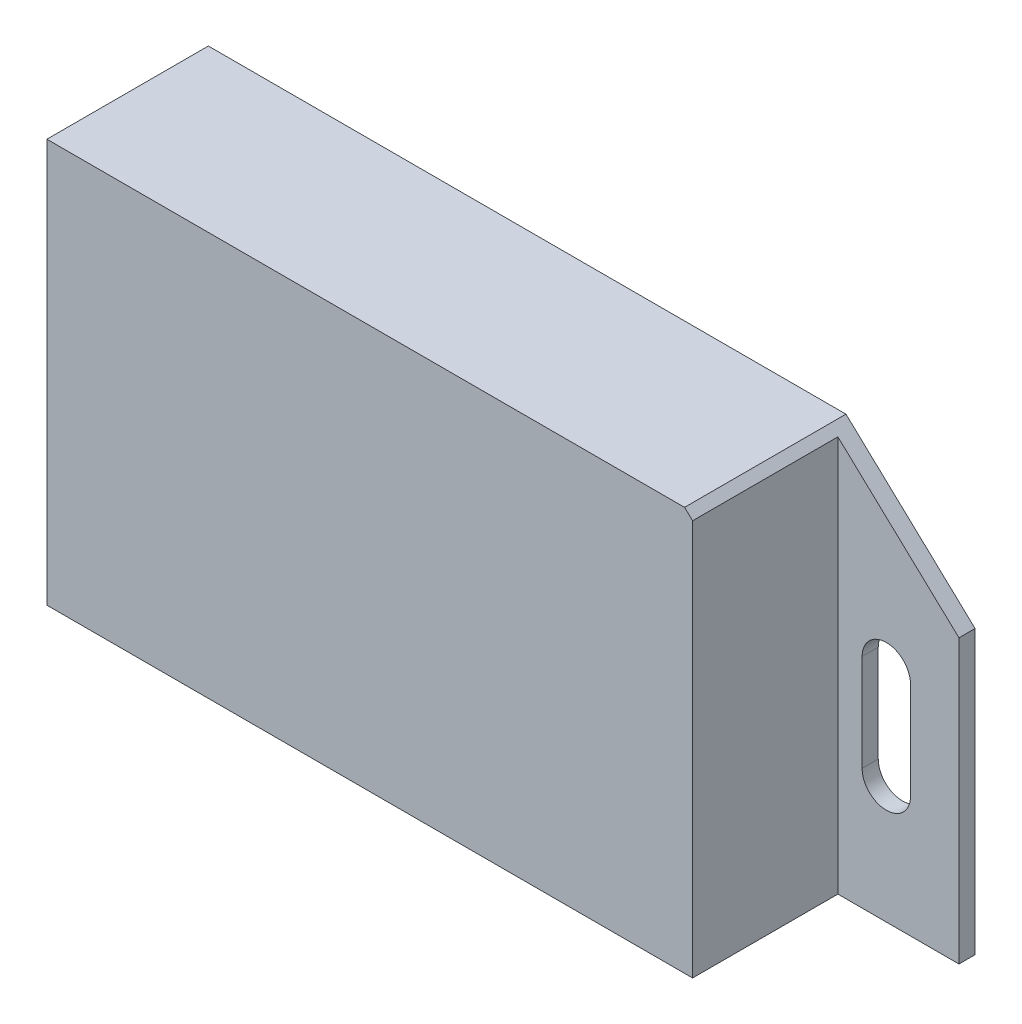
ISO-10303-21;
HEADER;
FILE_DESCRIPTION(('STEP AP214'),'2;1');
FILE_NAME('part.step','',(''),(''),'','','');
FILE_SCHEMA(('AUTOMOTIVE_DESIGN { 1 0 10303 214 1 1 1 1 }'));
ENDSEC;
DATA;
#1=APPLICATION_CONTEXT('core data for automotive mechanical design processes');
#2=APPLICATION_PROTOCOL_DEFINITION('international standard','automotive_design',2000,#1);
#3=PRODUCT_CONTEXT('',#1,'mechanical');
#4=PRODUCT('Part','Part','',(#3));
#5=PRODUCT_RELATED_PRODUCT_CATEGORY('part','',(#4));
#6=PRODUCT_DEFINITION_FORMATION('','',#4);
#7=PRODUCT_DEFINITION_CONTEXT('part definition',#1,'design');
#8=PRODUCT_DEFINITION('design','',#6,#7);
#9=PRODUCT_DEFINITION_SHAPE('','',#8);
#10=(LENGTH_UNIT() NAMED_UNIT(*) SI_UNIT(.MILLI.,.METRE.));
#11=(NAMED_UNIT(*) PLANE_ANGLE_UNIT() SI_UNIT($,.RADIAN.));
#12=(NAMED_UNIT(*) SI_UNIT($,.STERADIAN.) SOLID_ANGLE_UNIT());
#13=UNCERTAINTY_MEASURE_WITH_UNIT(LENGTH_MEASURE(1.E-05),#10,'distance_accuracy_value','');
#14=(GEOMETRIC_REPRESENTATION_CONTEXT(3) GLOBAL_UNCERTAINTY_ASSIGNED_CONTEXT((#13)) GLOBAL_UNIT_ASSIGNED_CONTEXT((#10,
#11,#12)) REPRESENTATION_CONTEXT('',''));
#15=CARTESIAN_POINT('',(0.,0.,0.));
#16=DIRECTION('',(0.,0.,1.));
#17=DIRECTION('',(1.,0.,0.));
#18=AXIS2_PLACEMENT_3D('',#15,#16,#17);
#19=CARTESIAN_POINT('',(-27.5,12.5,-10.));
#20=DIRECTION('',(-1.,0.,0.));
#21=DIRECTION('',(0.,0.,1.));
#22=AXIS2_PLACEMENT_3D('',#19,#20,#21);
#23=PLANE('',#22);
#24=DIRECTION('',(0.,-1.,0.));
#25=VECTOR('',#24,1.);
#26=CARTESIAN_POINT('',(-27.5,12.5,-9.));
#27=LINE('',#26,#25);
#28=CARTESIAN_POINT('',(-27.5,4.49999999999973,-9.));
#29=VERTEX_POINT('',#28);
#30=CARTESIAN_POINT('',(-27.5,-12.5,-9.));
#31=VERTEX_POINT('',#30);
#32=EDGE_CURVE('E377',#29,#31,#27,.T.);
#33=ORIENTED_EDGE('',*,*,#32,.F.);
#34=DIRECTION('',(0.,0.,-1.));
#35=VECTOR('',#34,1.);
#36=CARTESIAN_POINT('',(-27.5,4.49999999999973,-10.));
#37=LINE('',#36,#35);
#38=CARTESIAN_POINT('',(-27.5,4.49999999999973,-10.));
#39=VERTEX_POINT('',#38);
#40=EDGE_CURVE('E11',#29,#39,#37,.T.);
#41=ORIENTED_EDGE('',*,*,#40,.T.);
#42=DIRECTION('',(0.,-1.,0.));
#43=VECTOR('',#42,1.);
#44=CARTESIAN_POINT('',(-27.5,12.5,-10.));
#45=LINE('',#44,#43);
#46=CARTESIAN_POINT('',(-27.5,-12.5,-10.));
#47=VERTEX_POINT('',#46);
#48=EDGE_CURVE('E419',#39,#47,#45,.T.);
#49=ORIENTED_EDGE('',*,*,#48,.T.);
#50=DIRECTION('',(0.,0.,1.));
#51=VECTOR('',#50,1.);
#52=CARTESIAN_POINT('',(-27.5,-12.5,-10.));
#53=LINE('',#52,#51);
#54=EDGE_CURVE('E431',#47,#31,#53,.T.);
#55=ORIENTED_EDGE('',*,*,#54,.T.);
#56=EDGE_LOOP('',(#33,#41,#49,#55));
#57=FACE_BOUND('',#56,.T.);
#58=ADVANCED_FACE('F41',(#57),#23,.T.);
#59=CARTESIAN_POINT('',(27.5,12.5,-10.));
#60=DIRECTION('',(0.,1.,0.));
#61=DIRECTION('',(0.,0.,1.));
#62=AXIS2_PLACEMENT_3D('',#59,#60,#61);
#63=PLANE('',#62);
#64=DIRECTION('',(-1.,0.,0.));
#65=VECTOR('',#64,1.);
#66=CARTESIAN_POINT('',(27.5,12.5,0.));
#67=LINE('',#66,#65);
#68=CARTESIAN_POINT('',(19.4999999999997,12.5,0.));
#69=VERTEX_POINT('',#68);
#70=CARTESIAN_POINT('',(-20.,12.5,0.));
#71=VERTEX_POINT('',#70);
#72=EDGE_CURVE('E422',#69,#71,#67,.T.);
#73=ORIENTED_EDGE('',*,*,#72,.F.);
#74=DIRECTION('',(0.,0.,-1.));
#75=VECTOR('',#74,1.);
#76=CARTESIAN_POINT('',(19.4999999999997,12.5,-10.));
#77=LINE('',#76,#75);
#78=CARTESIAN_POINT('',(19.4999999999997,12.5,-10.));
#79=VERTEX_POINT('',#78);
#80=EDGE_CURVE('E476',#69,#79,#77,.T.);
#81=ORIENTED_EDGE('',*,*,#80,.T.);
#82=DIRECTION('',(-1.,0.,0.));
#83=VECTOR('',#82,1.);
#84=CARTESIAN_POINT('',(27.5,12.5,-10.));
#85=LINE('',#84,#83);
#86=CARTESIAN_POINT('',(-20.0000000000003,12.5,-10.));
#87=VERTEX_POINT('',#86);
#88=EDGE_CURVE('E428',#79,#87,#85,.T.);
#89=ORIENTED_EDGE('',*,*,#88,.T.);
#90=DIRECTION('',(0.,0.,1.));
#91=VECTOR('',#90,1.);
#92=CARTESIAN_POINT('',(-20.0000000000003,12.5,-10.));
#93=LINE('',#92,#91);
#94=CARTESIAN_POINT('',(-20.,12.5,-9.));
#95=VERTEX_POINT('',#94);
#96=EDGE_CURVE('E473',#87,#95,#93,.T.);
#97=ORIENTED_EDGE('',*,*,#96,.T.);
#98=DIRECTION('',(0.,0.,1.));
#99=VECTOR('',#98,1.);
#100=CARTESIAN_POINT('',(-20.,12.5,-9.));
#101=LINE('',#100,#99);
#102=EDGE_CURVE('E369',#95,#71,#101,.T.);
#103=ORIENTED_EDGE('',*,*,#102,.T.);
#104=EDGE_LOOP('',(#73,#81,#89,#97,#103));
#105=FACE_BOUND('',#104,.T.);
#106=ADVANCED_FACE('F514',(#105),#63,.T.);
#107=CARTESIAN_POINT('',(27.5,-12.5,-10.));
#108=DIRECTION('',(1.,0.,0.));
#109=DIRECTION('',(0.,0.,-1.));
#110=AXIS2_PLACEMENT_3D('',#107,#108,#109);
#111=PLANE('',#110);
#112=DIRECTION('',(0.,1.,0.));
#113=VECTOR('',#112,1.);
#114=CARTESIAN_POINT('',(27.5,-12.5,-10.));
#115=LINE('',#114,#113);
#116=CARTESIAN_POINT('',(27.5,-12.5,-10.));
#117=VERTEX_POINT('',#116);
#118=CARTESIAN_POINT('',(27.5,5.00000000000027,-10.));
#119=VERTEX_POINT('',#118);
#120=EDGE_CURVE('E425',#117,#119,#115,.T.);
#121=ORIENTED_EDGE('',*,*,#120,.T.);
#122=DIRECTION('',(0.,0.,1.));
#123=VECTOR('',#122,1.);
#124=CARTESIAN_POINT('',(27.5,5.00000000000027,-10.));
#125=LINE('',#124,#123);
#126=CARTESIAN_POINT('',(27.5,5.00000000000027,-9.));
#127=VERTEX_POINT('',#126);
#128=EDGE_CURVE('E464',#119,#127,#125,.T.);
#129=ORIENTED_EDGE('',*,*,#128,.T.);
#130=DIRECTION('',(0.,-1.,0.));
#131=VECTOR('',#130,1.);
#132=CARTESIAN_POINT('',(27.5,12.5,-9.));
#133=LINE('',#132,#131);
#134=CARTESIAN_POINT('',(27.5,-12.5,-9.));
#135=VERTEX_POINT('',#134);
#136=EDGE_CURVE('E363',#127,#135,#133,.T.);
#137=ORIENTED_EDGE('',*,*,#136,.T.);
#138=DIRECTION('',(0.,0.,1.));
#139=VECTOR('',#138,1.);
#140=CARTESIAN_POINT('',(27.5,-12.5,-10.));
#141=LINE('',#140,#139);
#142=EDGE_CURVE('E435',#117,#135,#141,.T.);
#143=ORIENTED_EDGE('',*,*,#142,.F.);
#144=EDGE_LOOP('',(#121,#129,#137,#143));
#145=FACE_BOUND('',#144,.T.);
#146=ADVANCED_FACE('F491',(#145),#111,.T.);
#147=CARTESIAN_POINT('',(-27.5,-12.5,-10.));
#148=DIRECTION('',(0.,-1.,0.));
#149=DIRECTION('',(0.,0.,-1.));
#150=AXIS2_PLACEMENT_3D('',#147,#148,#149);
#151=PLANE('',#150);
#152=DIRECTION('',(-1.,0.,0.));
#153=VECTOR('',#152,1.);
#154=CARTESIAN_POINT('',(10.,-12.5,-7.5));
#155=LINE('',#154,#153);
#156=CARTESIAN_POINT('',(10.,-12.5,-7.5));
#157=VERTEX_POINT('',#156);
#158=CARTESIAN_POINT('',(-10.,-12.5,-7.5));
#159=VERTEX_POINT('',#158);
#160=EDGE_CURVE('E246',#157,#159,#155,.T.);
#161=ORIENTED_EDGE('',*,*,#160,.F.);
#162=DIRECTION('',(0.,0.,1.));
#163=VECTOR('',#162,1.);
#164=CARTESIAN_POINT('',(10.,-12.5,-9.));
#165=LINE('',#164,#163);
#166=CARTESIAN_POINT('',(10.,-12.5,-9.));
#167=VERTEX_POINT('',#166);
#168=EDGE_CURVE('E263',#167,#157,#165,.T.);
#169=ORIENTED_EDGE('',*,*,#168,.F.);
#170=DIRECTION('',(1.,0.,0.));
#171=VECTOR('',#170,1.);
#172=CARTESIAN_POINT('',(-10.,-12.5,-9.));
#173=LINE('',#172,#171);
#174=CARTESIAN_POINT('',(-10.,-12.5,-9.));
#175=VERTEX_POINT('',#174);
#176=EDGE_CURVE('E266',#175,#167,#173,.T.);
#177=ORIENTED_EDGE('',*,*,#176,.F.);
#178=DIRECTION('',(0.,0.,-1.));
#179=VECTOR('',#178,1.);
#180=CARTESIAN_POINT('',(-10.,-12.5,-7.5));
#181=LINE('',#180,#179);
#182=EDGE_CURVE('E272',#159,#175,#181,.T.);
#183=ORIENTED_EDGE('',*,*,#182,.F.);
#184=EDGE_LOOP('',(#161,#169,#177,#183));
#185=FACE_BOUND('',#184,.T.);
#186=DIRECTION('',(1.,0.,0.));
#187=VECTOR('',#186,1.);
#188=CARTESIAN_POINT('',(-10.99589645914,-12.5,-2.8));
#189=LINE('',#188,#187);
#190=CARTESIAN_POINT('',(-10.99589645914,-12.5,-2.8));
#191=VERTEX_POINT('',#190);
#192=CARTESIAN_POINT('',(-10.2,-12.5,-2.8));
#193=VERTEX_POINT('',#192);
#194=EDGE_CURVE('E296',#191,#193,#189,.T.);
#195=ORIENTED_EDGE('',*,*,#194,.F.);
#196=DIRECTION('',(0.,0.,-1.));
#197=VECTOR('',#196,1.);
#198=CARTESIAN_POINT('',(-10.99589645914,-12.5,-2.));
#199=LINE('',#198,#197);
#200=CARTESIAN_POINT('',(-10.99589645914,-12.5,-2.));
#201=VERTEX_POINT('',#200);
#202=EDGE_CURVE('E308',#201,#191,#199,.T.);
#203=ORIENTED_EDGE('',*,*,#202,.F.);
#204=DIRECTION('',(1.,0.,0.));
#205=VECTOR('',#204,1.);
#206=CARTESIAN_POINT('',(-10.99589645914,-12.5,-2.));
#207=LINE('',#206,#205);
#208=CARTESIAN_POINT('',(-10.2,-12.5,-2.));
#209=VERTEX_POINT('',#208);
#210=EDGE_CURVE('E282',#201,#209,#207,.T.);
#211=ORIENTED_EDGE('',*,*,#210,.T.);
#212=DIRECTION('',(0.,0.,-1.));
#213=VECTOR('',#212,1.);
#214=CARTESIAN_POINT('',(-10.2,-12.5,-1.8));
#215=LINE('',#214,#213);
#216=CARTESIAN_POINT('',(-10.2,-12.5,-1.8));
#217=VERTEX_POINT('',#216);
#218=EDGE_CURVE('E403',#217,#209,#215,.T.);
#219=ORIENTED_EDGE('',*,*,#218,.F.);
#220=DIRECTION('',(-1.,0.,0.));
#221=VECTOR('',#220,1.);
#222=CARTESIAN_POINT('',(10.2,-12.5,-1.8));
#223=LINE('',#222,#221);
#224=CARTESIAN_POINT('',(10.2,-12.5,-1.8));
#225=VERTEX_POINT('',#224);
#226=EDGE_CURVE('E399',#225,#217,#223,.T.);
#227=ORIENTED_EDGE('',*,*,#226,.F.);
#228=DIRECTION('',(0.,0.,1.));
#229=VECTOR('',#228,1.);
#230=CARTESIAN_POINT('',(10.2,-12.5,-3.2));
#231=LINE('',#230,#229);
#232=CARTESIAN_POINT('',(10.2,-12.5,-3.2));
#233=VERTEX_POINT('',#232);
#234=EDGE_CURVE('E379',#233,#225,#231,.T.);
#235=ORIENTED_EDGE('',*,*,#234,.F.);
#236=DIRECTION('',(1.,0.,0.));
#237=VECTOR('',#236,1.);
#238=CARTESIAN_POINT('',(-10.2,-12.5,-3.2));
#239=LINE('',#238,#237);
#240=CARTESIAN_POINT('',(-10.2,-12.5,-3.2));
#241=VERTEX_POINT('',#240);
#242=EDGE_CURVE('E388',#241,#233,#239,.T.);
#243=ORIENTED_EDGE('',*,*,#242,.F.);
#244=EDGE_CURVE('E402',#193,#241,#215,.T.);
#245=ORIENTED_EDGE('',*,*,#244,.F.);
#246=EDGE_LOOP('',(#195,#203,#211,#219,#227,#235,#243,#245));
#247=FACE_BOUND('',#246,.T.);
#248=DIRECTION('',(1.,0.,0.));
#249=VECTOR('',#248,1.);
#250=CARTESIAN_POINT('',(20.,-12.5,-9.));
#251=LINE('',#250,#249);
#252=CARTESIAN_POINT('',(20.,-12.5,-9.));
#253=VERTEX_POINT('',#252);
#254=EDGE_CURVE('E359',#253,#135,#251,.T.);
#255=ORIENTED_EDGE('',*,*,#254,.F.);
#256=DIRECTION('',(0.,0.,-1.));
#257=VECTOR('',#256,1.);
#258=CARTESIAN_POINT('',(20.,-12.5,0.));
#259=LINE('',#258,#257);
#260=CARTESIAN_POINT('',(20.,-12.5,0.));
#261=VERTEX_POINT('',#260);
#262=EDGE_CURVE('E350',#261,#253,#259,.T.);
#263=ORIENTED_EDGE('',*,*,#262,.F.);
#264=DIRECTION('',(1.,0.,0.));
#265=VECTOR('',#264,1.);
#266=CARTESIAN_POINT('',(-27.5,-12.5,0.));
#267=LINE('',#266,#265);
#268=CARTESIAN_POINT('',(-20.,-12.5,0.));
#269=VERTEX_POINT('',#268);
#270=EDGE_CURVE('E411',#269,#261,#267,.T.);
#271=ORIENTED_EDGE('',*,*,#270,.F.);
#272=DIRECTION('',(0.,0.,1.));
#273=VECTOR('',#272,1.);
#274=CARTESIAN_POINT('',(-20.,-12.5,-9.));
#275=LINE('',#274,#273);
#276=CARTESIAN_POINT('',(-20.,-12.5,-9.));
#277=VERTEX_POINT('',#276);
#278=EDGE_CURVE('E373',#277,#269,#275,.T.);
#279=ORIENTED_EDGE('',*,*,#278,.F.);
#280=DIRECTION('',(1.,0.,0.));
#281=VECTOR('',#280,1.);
#282=CARTESIAN_POINT('',(-27.5,-12.5,-9.));
#283=LINE('',#282,#281);
#284=EDGE_CURVE('E365',#31,#277,#283,.T.);
#285=ORIENTED_EDGE('',*,*,#284,.F.);
#286=ORIENTED_EDGE('',*,*,#54,.F.);
#287=DIRECTION('',(1.,0.,0.));
#288=VECTOR('',#287,1.);
#289=CARTESIAN_POINT('',(-27.5,-12.5,-10.));
#290=LINE('',#289,#288);
#291=EDGE_CURVE('E421',#47,#117,#290,.T.);
#292=ORIENTED_EDGE('',*,*,#291,.T.);
#293=ORIENTED_EDGE('',*,*,#142,.T.);
#294=EDGE_LOOP('',(#255,#263,#271,#279,#285,#286,#292,#293));
#295=FACE_BOUND('',#294,.T.);
#296=ADVANCED_FACE('F506',(#185,#247,#295),#151,.T.);
#297=CARTESIAN_POINT('',(0.,0.,-10.));
#298=DIRECTION('',(0.,0.,1.));
#299=DIRECTION('',(1.,0.,0.));
#300=AXIS2_PLACEMENT_3D('',#297,#298,#299);
#301=PLANE('',#300);
#302=DIRECTION('',(0.,-1.,0.));
#303=VECTOR('',#302,1.);
#304=CARTESIAN_POINT('',(24.5,1.,-10.));
#305=LINE('',#304,#303);
#306=CARTESIAN_POINT('',(24.5,1.,-10.));
#307=VERTEX_POINT('',#306);
#308=CARTESIAN_POINT('',(24.5,-5.,-10.));
#309=VERTEX_POINT('',#308);
#310=EDGE_CURVE('E318',#307,#309,#305,.T.);
#311=ORIENTED_EDGE('',*,*,#310,.F.);
#312=CARTESIAN_POINT('',(23.,1.,-10.));
#313=DIRECTION('',(0.,0.,-1.));
#314=DIRECTION('',(-1.,0.,0.));
#315=AXIS2_PLACEMENT_3D('',#312,#313,#314);
#316=CIRCLE('',#315,1.5);
#317=CARTESIAN_POINT('',(21.5,1.,-10.));
#318=VERTEX_POINT('',#317);
#319=EDGE_CURVE('E310',#318,#307,#316,.T.);
#320=ORIENTED_EDGE('',*,*,#319,.F.);
#321=DIRECTION('',(0.,1.,0.));
#322=VECTOR('',#321,1.);
#323=CARTESIAN_POINT('',(21.5,-5.,-10.));
#324=LINE('',#323,#322);
#325=CARTESIAN_POINT('',(21.5,-5.,-10.));
#326=VERTEX_POINT('',#325);
#327=EDGE_CURVE('E324',#326,#318,#324,.T.);
#328=ORIENTED_EDGE('',*,*,#327,.F.);
#329=CARTESIAN_POINT('',(23.,-5.,-10.));
#330=DIRECTION('',(0.,0.,-1.));
#331=DIRECTION('',(-1.,0.,0.));
#332=AXIS2_PLACEMENT_3D('',#329,#330,#331);
#333=CIRCLE('',#332,1.5);
#334=EDGE_CURVE('E321',#309,#326,#333,.T.);
#335=ORIENTED_EDGE('',*,*,#334,.F.);
#336=EDGE_LOOP('',(#311,#320,#328,#335));
#337=FACE_BOUND('',#336,.T.);
#338=DIRECTION('',(0.,-1.,0.));
#339=VECTOR('',#338,1.);
#340=CARTESIAN_POINT('',(-21.5,1.,-10.));
#341=LINE('',#340,#339);
#342=CARTESIAN_POINT('',(-21.5,1.,-10.));
#343=VERTEX_POINT('',#342);
#344=CARTESIAN_POINT('',(-21.5,-5.,-10.));
#345=VERTEX_POINT('',#344);
#346=EDGE_CURVE('E338',#343,#345,#341,.T.);
#347=ORIENTED_EDGE('',*,*,#346,.F.);
#348=CARTESIAN_POINT('',(-23.,1.,-10.));
#349=DIRECTION('',(0.,0.,-1.));
#350=DIRECTION('',(-1.,0.,0.));
#351=AXIS2_PLACEMENT_3D('',#348,#349,#350);
#352=CIRCLE('',#351,1.5);
#353=CARTESIAN_POINT('',(-24.5,1.,-10.));
#354=VERTEX_POINT('',#353);
#355=EDGE_CURVE('E330',#354,#343,#352,.T.);
#356=ORIENTED_EDGE('',*,*,#355,.F.);
#357=DIRECTION('',(0.,1.,0.));
#358=VECTOR('',#357,1.);
#359=CARTESIAN_POINT('',(-24.5,-5.,-10.));
#360=LINE('',#359,#358);
#361=CARTESIAN_POINT('',(-24.5,-5.,-10.));
#362=VERTEX_POINT('',#361);
#363=EDGE_CURVE('E344',#362,#354,#360,.T.);
#364=ORIENTED_EDGE('',*,*,#363,.F.);
#365=CARTESIAN_POINT('',(-23.,-5.,-10.));
#366=DIRECTION('',(0.,0.,-1.));
#367=DIRECTION('',(-1.,0.,0.));
#368=AXIS2_PLACEMENT_3D('',#365,#366,#367);
#369=CIRCLE('',#368,1.5);
#370=EDGE_CURVE('E341',#345,#362,#369,.T.);
#371=ORIENTED_EDGE('',*,*,#370,.F.);
#372=EDGE_LOOP('',(#347,#356,#364,#371));
#373=FACE_BOUND('',#372,.T.);
#374=ORIENTED_EDGE('',*,*,#88,.F.);
#375=DIRECTION('',(-0.729537204140109,0.683941128881304,0.));
#376=VECTOR('',#375,1.);
#377=CARTESIAN_POINT('',(27.5,5.00000000000027,-10.));
#378=LINE('',#377,#376);
#379=EDGE_CURVE('E480',#79,#119,#378,.F.);
#380=ORIENTED_EDGE('',*,*,#379,.T.);
#381=ORIENTED_EDGE('',*,*,#120,.F.);
#382=ORIENTED_EDGE('',*,*,#291,.F.);
#383=ORIENTED_EDGE('',*,*,#48,.F.);
#384=DIRECTION('',(-0.683941128881304,-0.729537204140109,0.));
#385=VECTOR('',#384,1.);
#386=CARTESIAN_POINT('',(-20.0000000000003,12.5,-10.));
#387=LINE('',#386,#385);
#388=EDGE_CURVE('E478',#39,#87,#387,.F.);
#389=ORIENTED_EDGE('',*,*,#388,.T.);
#390=EDGE_LOOP('',(#374,#380,#381,#382,#383,#389));
#391=FACE_BOUND('',#390,.T.);
#392=ADVANCED_FACE('F485',(#337,#373,#391),#301,.F.);
#393=CARTESIAN_POINT('',(0.,0.,0.));
#394=DIRECTION('',(0.,0.,1.));
#395=DIRECTION('',(1.,0.,0.));
#396=AXIS2_PLACEMENT_3D('',#393,#394,#395);
#397=PLANE('',#396);
#398=DIRECTION('',(0.,-1.,0.));
#399=VECTOR('',#398,1.);
#400=CARTESIAN_POINT('',(20.,12.5,0.));
#401=LINE('',#400,#399);
#402=CARTESIAN_POINT('',(20.,12.0312499999998,0.));
#403=VERTEX_POINT('',#402);
#404=EDGE_CURVE('E362',#403,#261,#401,.T.);
#405=ORIENTED_EDGE('',*,*,#404,.F.);
#406=DIRECTION('',(0.729537204140109,-0.683941128881304,0.));
#407=VECTOR('',#406,1.);
#408=CARTESIAN_POINT('',(15.358627858627,16.3825363825366,0.));
#409=LINE('',#408,#407);
#410=EDGE_CURVE('E471',#403,#69,#409,.F.);
#411=ORIENTED_EDGE('',*,*,#410,.T.);
#412=ORIENTED_EDGE('',*,*,#72,.T.);
#413=DIRECTION('',(0.,-1.,0.));
#414=VECTOR('',#413,1.);
#415=CARTESIAN_POINT('',(-20.,12.5,0.));
#416=LINE('',#415,#414);
#417=EDGE_CURVE('E380',#71,#269,#416,.T.);
#418=ORIENTED_EDGE('',*,*,#417,.T.);
#419=ORIENTED_EDGE('',*,*,#270,.T.);
#420=EDGE_LOOP('',(#405,#411,#412,#418,#419));
#421=FACE_BOUND('',#420,.T.);
#422=ADVANCED_FACE('F522',(#421),#397,.T.);
#423=CARTESIAN_POINT('',(10.2,-10.5,-3.2));
#424=DIRECTION('',(1.,0.,0.));
#425=DIRECTION('',(0.,0.,-1.));
#426=AXIS2_PLACEMENT_3D('',#423,#424,#425);
#427=PLANE('',#426);
#428=ORIENTED_EDGE('',*,*,#234,.T.);
#429=DIRECTION('',(0.,-1.,0.));
#430=VECTOR('',#429,1.);
#431=CARTESIAN_POINT('',(10.2,-10.5,-1.8));
#432=LINE('',#431,#430);
#433=CARTESIAN_POINT('',(10.2,-10.5,-1.8));
#434=VERTEX_POINT('',#433);
#435=EDGE_CURVE('E397',#434,#225,#432,.T.);
#436=ORIENTED_EDGE('',*,*,#435,.F.);
#437=DIRECTION('',(0.,0.,1.));
#438=VECTOR('',#437,1.);
#439=CARTESIAN_POINT('',(10.2,-10.5,-3.2));
#440=LINE('',#439,#438);
#441=CARTESIAN_POINT('',(10.2,-10.5,-3.2));
#442=VERTEX_POINT('',#441);
#443=EDGE_CURVE('E384',#442,#434,#440,.T.);
#444=ORIENTED_EDGE('',*,*,#443,.F.);
#445=DIRECTION('',(0.,-1.,0.));
#446=VECTOR('',#445,1.);
#447=CARTESIAN_POINT('',(10.2,-10.5,-3.2));
#448=LINE('',#447,#446);
#449=EDGE_CURVE('E409',#442,#233,#448,.T.);
#450=ORIENTED_EDGE('',*,*,#449,.T.);
#451=EDGE_LOOP('',(#428,#436,#444,#450));
#452=FACE_BOUND('',#451,.T.);
#453=ADVANCED_FACE('F630',(#452),#427,.F.);
#454=CARTESIAN_POINT('',(-10.2,-10.5,-3.2));
#455=DIRECTION('',(0.,0.,-1.));
#456=DIRECTION('',(-1.,0.,0.));
#457=AXIS2_PLACEMENT_3D('',#454,#455,#456);
#458=PLANE('',#457);
#459=ORIENTED_EDGE('',*,*,#242,.T.);
#460=ORIENTED_EDGE('',*,*,#449,.F.);
#461=DIRECTION('',(1.,0.,0.));
#462=VECTOR('',#461,1.);
#463=CARTESIAN_POINT('',(-10.2,-10.5,-3.2));
#464=LINE('',#463,#462);
#465=CARTESIAN_POINT('',(-10.2,-10.5,-3.2));
#466=VERTEX_POINT('',#465);
#467=EDGE_CURVE('E394',#466,#442,#464,.T.);
#468=ORIENTED_EDGE('',*,*,#467,.F.);
#469=DIRECTION('',(0.,-1.,0.));
#470=VECTOR('',#469,1.);
#471=CARTESIAN_POINT('',(-10.2,-10.5,-3.2));
#472=LINE('',#471,#470);
#473=EDGE_CURVE('E412',#466,#241,#472,.T.);
#474=ORIENTED_EDGE('',*,*,#473,.T.);
#475=EDGE_LOOP('',(#459,#460,#468,#474));
#476=FACE_BOUND('',#475,.T.);
#477=ADVANCED_FACE('F626',(#476),#458,.F.);
#478=CARTESIAN_POINT('',(-10.2,-10.5,-1.8));
#479=DIRECTION('',(-1.,0.,0.));
#480=DIRECTION('',(0.,0.,1.));
#481=AXIS2_PLACEMENT_3D('',#478,#479,#480);
#482=PLANE('',#481);
#483=ORIENTED_EDGE('',*,*,#218,.T.);
#484=EDGE_CURVE('E406',#209,#193,#215,.T.);
#485=ORIENTED_EDGE('',*,*,#484,.T.);
#486=ORIENTED_EDGE('',*,*,#244,.T.);
#487=ORIENTED_EDGE('',*,*,#473,.F.);
#488=DIRECTION('',(0.,0.,-1.));
#489=VECTOR('',#488,1.);
#490=CARTESIAN_POINT('',(-10.2,-10.5,-1.8));
#491=LINE('',#490,#489);
#492=CARTESIAN_POINT('',(-10.2,-10.5,-1.8));
#493=VERTEX_POINT('',#492);
#494=EDGE_CURVE('E391',#493,#466,#491,.T.);
#495=ORIENTED_EDGE('',*,*,#494,.F.);
#496=DIRECTION('',(0.,-1.,0.));
#497=VECTOR('',#496,1.);
#498=CARTESIAN_POINT('',(-10.2,-10.5,-1.8));
#499=LINE('',#498,#497);
#500=EDGE_CURVE('E415',#493,#217,#499,.T.);
#501=ORIENTED_EDGE('',*,*,#500,.T.);
#502=EDGE_LOOP('',(#483,#485,#486,#487,#495,#501));
#503=FACE_BOUND('',#502,.T.);
#504=ADVANCED_FACE('F629',(#503),#482,.F.);
#505=CARTESIAN_POINT('',(10.2,-10.5,-1.8));
#506=DIRECTION('',(0.,0.,1.));
#507=DIRECTION('',(1.,0.,0.));
#508=AXIS2_PLACEMENT_3D('',#505,#506,#507);
#509=PLANE('',#508);
#510=ORIENTED_EDGE('',*,*,#226,.T.);
#511=ORIENTED_EDGE('',*,*,#500,.F.);
#512=DIRECTION('',(-1.,0.,0.));
#513=VECTOR('',#512,1.);
#514=CARTESIAN_POINT('',(10.2,-10.5,-1.8));
#515=LINE('',#514,#513);
#516=EDGE_CURVE('E387',#434,#493,#515,.T.);
#517=ORIENTED_EDGE('',*,*,#516,.F.);
#518=ORIENTED_EDGE('',*,*,#435,.T.);
#519=EDGE_LOOP('',(#510,#511,#517,#518));
#520=FACE_BOUND('',#519,.T.);
#521=ADVANCED_FACE('F624',(#520),#509,.F.);
#522=CARTESIAN_POINT('',(0.,-10.5,0.));
#523=DIRECTION('',(0.,-1.,0.));
#524=DIRECTION('',(0.,0.,-1.));
#525=AXIS2_PLACEMENT_3D('',#522,#523,#524);
#526=PLANE('',#525);
#527=ORIENTED_EDGE('',*,*,#443,.T.);
#528=ORIENTED_EDGE('',*,*,#516,.T.);
#529=ORIENTED_EDGE('',*,*,#494,.T.);
#530=ORIENTED_EDGE('',*,*,#467,.T.);
#531=EDGE_LOOP('',(#527,#528,#529,#530));
#532=FACE_BOUND('',#531,.T.);
#533=ADVANCED_FACE('F620',(#532),#526,.T.);
#534=CARTESIAN_POINT('',(-27.5,12.5,-9.));
#535=DIRECTION('',(0.,0.,-1.));
#536=DIRECTION('',(-1.,0.,0.));
#537=AXIS2_PLACEMENT_3D('',#534,#535,#536);
#538=PLANE('',#537);
#539=DIRECTION('',(0.,1.,0.));
#540=VECTOR('',#539,1.);
#541=CARTESIAN_POINT('',(-24.5,12.5,-9.));
#542=LINE('',#541,#540);
#543=CARTESIAN_POINT('',(-24.5,-5.,-9.));
#544=VERTEX_POINT('',#543);
#545=CARTESIAN_POINT('',(-24.5,1.,-9.));
#546=VERTEX_POINT('',#545);
#547=EDGE_CURVE('E446',#544,#546,#542,.T.);
#548=ORIENTED_EDGE('',*,*,#547,.T.);
#549=CARTESIAN_POINT('',(-23.,1.,-9.));
#550=DIRECTION('',(0.,0.,-1.));
#551=DIRECTION('',(-1.,0.,0.));
#552=AXIS2_PLACEMENT_3D('',#549,#550,#551);
#553=CIRCLE('',#552,1.5);
#554=CARTESIAN_POINT('',(-21.5,1.,-9.));
#555=VERTEX_POINT('',#554);
#556=EDGE_CURVE('E449',#546,#555,#553,.T.);
#557=ORIENTED_EDGE('',*,*,#556,.T.);
#558=DIRECTION('',(0.,-1.,0.));
#559=VECTOR('',#558,1.);
#560=CARTESIAN_POINT('',(-21.5,12.5,-9.));
#561=LINE('',#560,#559);
#562=CARTESIAN_POINT('',(-21.5,-5.,-9.));
#563=VERTEX_POINT('',#562);
#564=EDGE_CURVE('E438',#555,#563,#561,.T.);
#565=ORIENTED_EDGE('',*,*,#564,.T.);
#566=CARTESIAN_POINT('',(-23.,-5.,-9.));
#567=DIRECTION('',(0.,0.,-1.));
#568=DIRECTION('',(-1.,0.,0.));
#569=AXIS2_PLACEMENT_3D('',#566,#567,#568);
#570=CIRCLE('',#569,1.5);
#571=EDGE_CURVE('E443',#563,#544,#570,.T.);
#572=ORIENTED_EDGE('',*,*,#571,.T.);
#573=EDGE_LOOP('',(#548,#557,#565,#572));
#574=FACE_BOUND('',#573,.T.);
#575=DIRECTION('',(0.,-1.,0.));
#576=VECTOR('',#575,1.);
#577=CARTESIAN_POINT('',(-20.,12.5,-9.));
#578=LINE('',#577,#576);
#579=EDGE_CURVE('E372',#95,#277,#578,.T.);
#580=ORIENTED_EDGE('',*,*,#579,.F.);
#581=DIRECTION('',(0.683941128881304,0.729537204140109,0.));
#582=VECTOR('',#581,1.);
#583=CARTESIAN_POINT('',(-20.0000000000003,12.5,-9.));
#584=LINE('',#583,#582);
#585=EDGE_CURVE('E50',#95,#29,#584,.F.);
#586=ORIENTED_EDGE('',*,*,#585,.T.);
#587=ORIENTED_EDGE('',*,*,#32,.T.);
#588=ORIENTED_EDGE('',*,*,#284,.T.);
#589=EDGE_LOOP('',(#580,#586,#587,#588));
#590=FACE_BOUND('',#589,.T.);
#591=ADVANCED_FACE('F516',(#574,#590),#538,.F.);
#592=CARTESIAN_POINT('',(-20.,12.5,-9.));
#593=DIRECTION('',(1.,0.,0.));
#594=DIRECTION('',(0.,0.,-1.));
#595=AXIS2_PLACEMENT_3D('',#592,#593,#594);
#596=PLANE('',#595);
#597=ORIENTED_EDGE('',*,*,#278,.T.);
#598=ORIENTED_EDGE('',*,*,#417,.F.);
#599=ORIENTED_EDGE('',*,*,#102,.F.);
#600=ORIENTED_EDGE('',*,*,#579,.T.);
#601=EDGE_LOOP('',(#597,#598,#599,#600));
#602=FACE_BOUND('',#601,.T.);
#603=ADVANCED_FACE('F520',(#602),#596,.F.);
#604=CARTESIAN_POINT('',(20.,12.5,-9.));
#605=DIRECTION('',(0.,0.,-1.));
#606=DIRECTION('',(-1.,0.,0.));
#607=AXIS2_PLACEMENT_3D('',#604,#605,#606);
#608=PLANE('',#607);
#609=DIRECTION('',(0.,1.,0.));
#610=VECTOR('',#609,1.);
#611=CARTESIAN_POINT('',(21.5,12.5,-9.));
#612=LINE('',#611,#610);
#613=CARTESIAN_POINT('',(21.5,-5.,-9.));
#614=VERTEX_POINT('',#613);
#615=CARTESIAN_POINT('',(21.5,1.,-9.));
#616=VERTEX_POINT('',#615);
#617=EDGE_CURVE('E458',#614,#616,#612,.T.);
#618=ORIENTED_EDGE('',*,*,#617,.T.);
#619=CARTESIAN_POINT('',(23.,1.,-9.));
#620=DIRECTION('',(0.,0.,-1.));
#621=DIRECTION('',(-1.,0.,0.));
#622=AXIS2_PLACEMENT_3D('',#619,#620,#621);
#623=CIRCLE('',#622,1.5);
#624=CARTESIAN_POINT('',(24.5,1.,-9.));
#625=VERTEX_POINT('',#624);
#626=EDGE_CURVE('E461',#616,#625,#623,.T.);
#627=ORIENTED_EDGE('',*,*,#626,.T.);
#628=DIRECTION('',(0.,-1.,0.));
#629=VECTOR('',#628,1.);
#630=CARTESIAN_POINT('',(24.5,12.5,-9.));
#631=LINE('',#630,#629);
#632=CARTESIAN_POINT('',(24.5,-5.,-9.));
#633=VERTEX_POINT('',#632);
#634=EDGE_CURVE('E452',#625,#633,#631,.T.);
#635=ORIENTED_EDGE('',*,*,#634,.T.);
#636=CARTESIAN_POINT('',(23.,-5.,-9.));
#637=DIRECTION('',(0.,0.,-1.));
#638=DIRECTION('',(-1.,0.,0.));
#639=AXIS2_PLACEMENT_3D('',#636,#637,#638);
#640=CIRCLE('',#639,1.5);
#641=EDGE_CURVE('E455',#633,#614,#640,.T.);
#642=ORIENTED_EDGE('',*,*,#641,.T.);
#643=EDGE_LOOP('',(#618,#627,#635,#642));
#644=FACE_BOUND('',#643,.T.);
#645=ORIENTED_EDGE('',*,*,#136,.F.);
#646=DIRECTION('',(0.729537204140109,-0.683941128881304,0.));
#647=VECTOR('',#646,1.);
#648=CARTESIAN_POINT('',(27.5,5.00000000000027,-9.));
#649=LINE('',#648,#647);
#650=CARTESIAN_POINT('',(20.,12.0312499999998,-9.));
#651=VERTEX_POINT('',#650);
#652=EDGE_CURVE('E467',#127,#651,#649,.F.);
#653=ORIENTED_EDGE('',*,*,#652,.T.);
#654=DIRECTION('',(0.,-1.,0.));
#655=VECTOR('',#654,1.);
#656=CARTESIAN_POINT('',(20.,12.5,-9.));
#657=LINE('',#656,#655);
#658=EDGE_CURVE('E366',#651,#253,#657,.T.);
#659=ORIENTED_EDGE('',*,*,#658,.T.);
#660=ORIENTED_EDGE('',*,*,#254,.T.);
#661=EDGE_LOOP('',(#645,#653,#659,#660));
#662=FACE_BOUND('',#661,.T.);
#663=ADVANCED_FACE('F498',(#644,#662),#608,.F.);
#664=CARTESIAN_POINT('',(20.,12.5,0.));
#665=DIRECTION('',(-1.,0.,0.));
#666=DIRECTION('',(0.,0.,1.));
#667=AXIS2_PLACEMENT_3D('',#664,#665,#666);
#668=PLANE('',#667);
#669=ORIENTED_EDGE('',*,*,#658,.F.);
#670=DIRECTION('',(0.,0.,-1.));
#671=VECTOR('',#670,1.);
#672=CARTESIAN_POINT('',(20.,12.0312499999998,-10.));
#673=LINE('',#672,#671);
#674=EDGE_CURVE('E469',#651,#403,#673,.F.);
#675=ORIENTED_EDGE('',*,*,#674,.T.);
#676=ORIENTED_EDGE('',*,*,#404,.T.);
#677=ORIENTED_EDGE('',*,*,#262,.T.);
#678=EDGE_LOOP('',(#669,#675,#676,#677));
#679=FACE_BOUND('',#678,.T.);
#680=ADVANCED_FACE('F500',(#679),#668,.F.);
#681=CARTESIAN_POINT('',(-23.,1.,0.));
#682=DIRECTION('',(0.,0.,-1.));
#683=DIRECTION('',(-1.,0.,0.));
#684=AXIS2_PLACEMENT_3D('',#681,#682,#683);
#685=CYLINDRICAL_SURFACE('',#684,1.5);
#686=DIRECTION('',(0.,0.,-1.));
#687=VECTOR('',#686,1.);
#688=CARTESIAN_POINT('',(-24.5,1.,0.));
#689=LINE('',#688,#687);
#690=EDGE_CURVE('E348',#546,#354,#689,.T.);
#691=ORIENTED_EDGE('',*,*,#690,.T.);
#692=ORIENTED_EDGE('',*,*,#355,.T.);
#693=DIRECTION('',(0.,0.,-1.));
#694=VECTOR('',#693,1.);
#695=CARTESIAN_POINT('',(-21.5,1.,0.));
#696=LINE('',#695,#694);
#697=EDGE_CURVE('E347',#555,#343,#696,.T.);
#698=ORIENTED_EDGE('',*,*,#697,.F.);
#699=ORIENTED_EDGE('',*,*,#556,.F.);
#700=EDGE_LOOP('',(#691,#692,#698,#699));
#701=FACE_BOUND('',#700,.T.);
#702=ADVANCED_FACE('F600',(#701),#685,.F.);
#703=CARTESIAN_POINT('',(-24.5,-5.,0.));
#704=DIRECTION('',(-1.,0.,0.));
#705=DIRECTION('',(0.,0.,1.));
#706=AXIS2_PLACEMENT_3D('',#703,#704,#705);
#707=PLANE('',#706);
#708=DIRECTION('',(0.,0.,-1.));
#709=VECTOR('',#708,1.);
#710=CARTESIAN_POINT('',(-24.5,-5.,0.));
#711=LINE('',#710,#709);
#712=EDGE_CURVE('E351',#544,#362,#711,.T.);
#713=ORIENTED_EDGE('',*,*,#712,.T.);
#714=ORIENTED_EDGE('',*,*,#363,.T.);
#715=ORIENTED_EDGE('',*,*,#690,.F.);
#716=ORIENTED_EDGE('',*,*,#547,.F.);
#717=EDGE_LOOP('',(#713,#714,#715,#716));
#718=FACE_BOUND('',#717,.T.);
#719=ADVANCED_FACE('F596',(#718),#707,.F.);
#720=CARTESIAN_POINT('',(-23.,-5.,0.));
#721=DIRECTION('',(0.,0.,-1.));
#722=DIRECTION('',(-1.,0.,0.));
#723=AXIS2_PLACEMENT_3D('',#720,#721,#722);
#724=CYLINDRICAL_SURFACE('',#723,1.5);
#725=DIRECTION('',(0.,0.,-1.));
#726=VECTOR('',#725,1.);
#727=CARTESIAN_POINT('',(-21.5,-5.,0.));
#728=LINE('',#727,#726);
#729=EDGE_CURVE('E353',#563,#345,#728,.T.);
#730=ORIENTED_EDGE('',*,*,#729,.T.);
#731=ORIENTED_EDGE('',*,*,#370,.T.);
#732=ORIENTED_EDGE('',*,*,#712,.F.);
#733=ORIENTED_EDGE('',*,*,#571,.F.);
#734=EDGE_LOOP('',(#730,#731,#732,#733));
#735=FACE_BOUND('',#734,.T.);
#736=ADVANCED_FACE('F599',(#735),#724,.F.);
#737=CARTESIAN_POINT('',(-21.5,1.,0.));
#738=DIRECTION('',(1.,0.,0.));
#739=DIRECTION('',(0.,0.,-1.));
#740=AXIS2_PLACEMENT_3D('',#737,#738,#739);
#741=PLANE('',#740);
#742=ORIENTED_EDGE('',*,*,#697,.T.);
#743=ORIENTED_EDGE('',*,*,#346,.T.);
#744=ORIENTED_EDGE('',*,*,#729,.F.);
#745=ORIENTED_EDGE('',*,*,#564,.F.);
#746=EDGE_LOOP('',(#742,#743,#744,#745));
#747=FACE_BOUND('',#746,.T.);
#748=ADVANCED_FACE('F594',(#747),#741,.F.);
#749=CARTESIAN_POINT('',(23.,1.,0.));
#750=DIRECTION('',(0.,0.,-1.));
#751=DIRECTION('',(-1.,0.,0.));
#752=AXIS2_PLACEMENT_3D('',#749,#750,#751);
#753=CYLINDRICAL_SURFACE('',#752,1.5);
#754=DIRECTION('',(0.,0.,-1.));
#755=VECTOR('',#754,1.);
#756=CARTESIAN_POINT('',(21.5,1.,0.));
#757=LINE('',#756,#755);
#758=EDGE_CURVE('E328',#616,#318,#757,.T.);
#759=ORIENTED_EDGE('',*,*,#758,.T.);
#760=ORIENTED_EDGE('',*,*,#319,.T.);
#761=DIRECTION('',(0.,0.,-1.));
#762=VECTOR('',#761,1.);
#763=CARTESIAN_POINT('',(24.5,1.,0.));
#764=LINE('',#763,#762);
#765=EDGE_CURVE('E327',#625,#307,#764,.T.);
#766=ORIENTED_EDGE('',*,*,#765,.F.);
#767=ORIENTED_EDGE('',*,*,#626,.F.);
#768=EDGE_LOOP('',(#759,#760,#766,#767));
#769=FACE_BOUND('',#768,.T.);
#770=ADVANCED_FACE('F584',(#769),#753,.F.);
#771=CARTESIAN_POINT('',(21.5,-5.,0.));
#772=DIRECTION('',(-1.,0.,0.));
#773=DIRECTION('',(0.,0.,1.));
#774=AXIS2_PLACEMENT_3D('',#771,#772,#773);
#775=PLANE('',#774);
#776=DIRECTION('',(0.,0.,-1.));
#777=VECTOR('',#776,1.);
#778=CARTESIAN_POINT('',(21.5,-5.,0.));
#779=LINE('',#778,#777);
#780=EDGE_CURVE('E331',#614,#326,#779,.T.);
#781=ORIENTED_EDGE('',*,*,#780,.T.);
#782=ORIENTED_EDGE('',*,*,#327,.T.);
#783=ORIENTED_EDGE('',*,*,#758,.F.);
#784=ORIENTED_EDGE('',*,*,#617,.F.);
#785=EDGE_LOOP('',(#781,#782,#783,#784));
#786=FACE_BOUND('',#785,.T.);
#787=ADVANCED_FACE('F580',(#786),#775,.F.);
#788=CARTESIAN_POINT('',(23.,-5.,0.));
#789=DIRECTION('',(0.,0.,-1.));
#790=DIRECTION('',(-1.,0.,0.));
#791=AXIS2_PLACEMENT_3D('',#788,#789,#790);
#792=CYLINDRICAL_SURFACE('',#791,1.5);
#793=DIRECTION('',(0.,0.,-1.));
#794=VECTOR('',#793,1.);
#795=CARTESIAN_POINT('',(24.5,-5.,0.));
#796=LINE('',#795,#794);
#797=EDGE_CURVE('E333',#633,#309,#796,.T.);
#798=ORIENTED_EDGE('',*,*,#797,.T.);
#799=ORIENTED_EDGE('',*,*,#334,.T.);
#800=ORIENTED_EDGE('',*,*,#780,.F.);
#801=ORIENTED_EDGE('',*,*,#641,.F.);
#802=EDGE_LOOP('',(#798,#799,#800,#801));
#803=FACE_BOUND('',#802,.T.);
#804=ADVANCED_FACE('F583',(#803),#792,.F.);
#805=CARTESIAN_POINT('',(24.5,1.,0.));
#806=DIRECTION('',(1.,0.,0.));
#807=DIRECTION('',(0.,0.,-1.));
#808=AXIS2_PLACEMENT_3D('',#805,#806,#807);
#809=PLANE('',#808);
#810=ORIENTED_EDGE('',*,*,#765,.T.);
#811=ORIENTED_EDGE('',*,*,#310,.T.);
#812=ORIENTED_EDGE('',*,*,#797,.F.);
#813=ORIENTED_EDGE('',*,*,#634,.F.);
#814=EDGE_LOOP('',(#810,#811,#812,#813));
#815=FACE_BOUND('',#814,.T.);
#816=ADVANCED_FACE('F578',(#815),#809,.F.);
#817=CARTESIAN_POINT('',(-10.99589645914,-12.5,-2.));
#818=DIRECTION('',(0.,1.,0.));
#819=DIRECTION('',(0.,0.,1.));
#820=AXIS2_PLACEMENT_3D('',#817,#818,#819);
#821=PLANE('',#820);
#822=ORIENTED_EDGE('',*,*,#484,.F.);
#823=CARTESIAN_POINT('',(10.,-12.5,-2.));
#824=VERTEX_POINT('',#823);
#825=EDGE_CURVE('E286',#209,#824,#207,.T.);
#826=ORIENTED_EDGE('',*,*,#825,.T.);
#827=DIRECTION('',(0.,0.,-1.));
#828=VECTOR('',#827,1.);
#829=CARTESIAN_POINT('',(10.,-12.5,-2.));
#830=LINE('',#829,#828);
#831=CARTESIAN_POINT('',(10.,-12.5,-2.8));
#832=VERTEX_POINT('',#831);
#833=EDGE_CURVE('E295',#824,#832,#830,.T.);
#834=ORIENTED_EDGE('',*,*,#833,.T.);
#835=EDGE_CURVE('E278',#193,#832,#189,.T.);
#836=ORIENTED_EDGE('',*,*,#835,.F.);
#837=EDGE_LOOP('',(#822,#826,#834,#836));
#838=FACE_BOUND('',#837,.T.);
#839=ADVANCED_FACE('F568',(#838),#821,.T.);
#840=CARTESIAN_POINT('',(-10.99589645914,-13.5,-2.));
#841=DIRECTION('',(-1.,0.,0.));
#842=DIRECTION('',(0.,0.,1.));
#843=AXIS2_PLACEMENT_3D('',#840,#841,#842);
#844=PLANE('',#843);
#845=DIRECTION('',(0.,1.,0.));
#846=VECTOR('',#845,1.);
#847=CARTESIAN_POINT('',(-10.99589645914,-13.5,-2.8));
#848=LINE('',#847,#846);
#849=CARTESIAN_POINT('',(-10.99589645914,-13.5,-2.8));
#850=VERTEX_POINT('',#849);
#851=EDGE_CURVE('E305',#850,#191,#848,.T.);
#852=ORIENTED_EDGE('',*,*,#851,.F.);
#853=DIRECTION('',(0.,0.,-1.));
#854=VECTOR('',#853,1.);
#855=CARTESIAN_POINT('',(-10.99589645914,-13.5,-2.));
#856=LINE('',#855,#854);
#857=CARTESIAN_POINT('',(-10.99589645914,-13.5,-2.));
#858=VERTEX_POINT('',#857);
#859=EDGE_CURVE('E311',#858,#850,#856,.T.);
#860=ORIENTED_EDGE('',*,*,#859,.F.);
#861=DIRECTION('',(0.,1.,0.));
#862=VECTOR('',#861,1.);
#863=CARTESIAN_POINT('',(-10.99589645914,-13.5,-2.));
#864=LINE('',#863,#862);
#865=EDGE_CURVE('E292',#858,#201,#864,.T.);
#866=ORIENTED_EDGE('',*,*,#865,.T.);
#867=ORIENTED_EDGE('',*,*,#202,.T.);
#868=EDGE_LOOP('',(#852,#860,#866,#867));
#869=FACE_BOUND('',#868,.T.);
#870=ADVANCED_FACE('F564',(#869),#844,.T.);
#871=CARTESIAN_POINT('',(10.,-13.5,-2.));
#872=DIRECTION('',(0.,-1.,0.));
#873=DIRECTION('',(0.,0.,-1.));
#874=AXIS2_PLACEMENT_3D('',#871,#872,#873);
#875=PLANE('',#874);
#876=DIRECTION('',(-1.,0.,0.));
#877=VECTOR('',#876,1.);
#878=CARTESIAN_POINT('',(10.,-13.5,-2.8));
#879=LINE('',#878,#877);
#880=CARTESIAN_POINT('',(10.,-13.5,-2.8));
#881=VERTEX_POINT('',#880);
#882=EDGE_CURVE('E302',#881,#850,#879,.T.);
#883=ORIENTED_EDGE('',*,*,#882,.F.);
#884=DIRECTION('',(0.,0.,-1.));
#885=VECTOR('',#884,1.);
#886=CARTESIAN_POINT('',(10.,-13.5,-2.));
#887=LINE('',#886,#885);
#888=CARTESIAN_POINT('',(10.,-13.5,-2.));
#889=VERTEX_POINT('',#888);
#890=EDGE_CURVE('E313',#889,#881,#887,.T.);
#891=ORIENTED_EDGE('',*,*,#890,.F.);
#892=DIRECTION('',(-1.,0.,0.));
#893=VECTOR('',#892,1.);
#894=CARTESIAN_POINT('',(10.,-13.5,-2.));
#895=LINE('',#894,#893);
#896=EDGE_CURVE('E289',#889,#858,#895,.T.);
#897=ORIENTED_EDGE('',*,*,#896,.T.);
#898=ORIENTED_EDGE('',*,*,#859,.T.);
#899=EDGE_LOOP('',(#883,#891,#897,#898));
#900=FACE_BOUND('',#899,.T.);
#901=ADVANCED_FACE('F567',(#900),#875,.T.);
#902=CARTESIAN_POINT('',(10.,-12.5,-2.));
#903=DIRECTION('',(1.,0.,0.));
#904=DIRECTION('',(0.,0.,-1.));
#905=AXIS2_PLACEMENT_3D('',#902,#903,#904);
#906=PLANE('',#905);
#907=DIRECTION('',(0.,-1.,0.));
#908=VECTOR('',#907,1.);
#909=CARTESIAN_POINT('',(10.,-12.5,-2.8));
#910=LINE('',#909,#908);
#911=EDGE_CURVE('E299',#832,#881,#910,.T.);
#912=ORIENTED_EDGE('',*,*,#911,.F.);
#913=ORIENTED_EDGE('',*,*,#833,.F.);
#914=DIRECTION('',(0.,-1.,0.));
#915=VECTOR('',#914,1.);
#916=CARTESIAN_POINT('',(10.,-12.5,-2.));
#917=LINE('',#916,#915);
#918=EDGE_CURVE('E285',#824,#889,#917,.T.);
#919=ORIENTED_EDGE('',*,*,#918,.T.);
#920=ORIENTED_EDGE('',*,*,#890,.T.);
#921=EDGE_LOOP('',(#912,#913,#919,#920));
#922=FACE_BOUND('',#921,.T.);
#923=ADVANCED_FACE('F559',(#922),#906,.T.);
#924=CARTESIAN_POINT('',(0.,0.,-2.));
#925=DIRECTION('',(0.,0.,-1.));
#926=DIRECTION('',(-1.,0.,0.));
#927=AXIS2_PLACEMENT_3D('',#924,#925,#926);
#928=PLANE('',#927);
#929=ORIENTED_EDGE('',*,*,#210,.F.);
#930=ORIENTED_EDGE('',*,*,#865,.F.);
#931=ORIENTED_EDGE('',*,*,#896,.F.);
#932=ORIENTED_EDGE('',*,*,#918,.F.);
#933=ORIENTED_EDGE('',*,*,#825,.F.);
#934=EDGE_LOOP('',(#929,#930,#931,#932,#933));
#935=FACE_BOUND('',#934,.T.);
#936=ADVANCED_FACE('F556',(#935),#928,.F.);
#937=CARTESIAN_POINT('',(0.,0.,-2.8));
#938=DIRECTION('',(0.,0.,-1.));
#939=DIRECTION('',(-1.,0.,0.));
#940=AXIS2_PLACEMENT_3D('',#937,#938,#939);
#941=PLANE('',#940);
#942=ORIENTED_EDGE('',*,*,#194,.T.);
#943=ORIENTED_EDGE('',*,*,#835,.T.);
#944=ORIENTED_EDGE('',*,*,#911,.T.);
#945=ORIENTED_EDGE('',*,*,#882,.T.);
#946=ORIENTED_EDGE('',*,*,#851,.T.);
#947=EDGE_LOOP('',(#942,#943,#944,#945,#946));
#948=FACE_BOUND('',#947,.T.);
#949=ADVANCED_FACE('F555',(#948),#941,.T.);
#950=CARTESIAN_POINT('',(10.,-2.5,-7.5));
#951=DIRECTION('',(0.,0.,1.));
#952=DIRECTION('',(1.,0.,0.));
#953=AXIS2_PLACEMENT_3D('',#950,#951,#952);
#954=PLANE('',#953);
#955=ORIENTED_EDGE('',*,*,#160,.T.);
#956=DIRECTION('',(0.,-1.,0.));
#957=VECTOR('',#956,1.);
#958=CARTESIAN_POINT('',(-10.,-2.5,-7.5));
#959=LINE('',#958,#957);
#960=CARTESIAN_POINT('',(-10.,-2.5,-7.5));
#961=VERTEX_POINT('',#960);
#962=EDGE_CURVE('E239',#961,#159,#959,.T.);
#963=ORIENTED_EDGE('',*,*,#962,.F.);
#964=DIRECTION('',(-1.,0.,0.));
#965=VECTOR('',#964,1.);
#966=CARTESIAN_POINT('',(10.,-2.5,-7.5));
#967=LINE('',#966,#965);
#968=CARTESIAN_POINT('',(10.,-2.5,-7.5));
#969=VERTEX_POINT('',#968);
#970=EDGE_CURVE('E243',#969,#961,#967,.T.);
#971=ORIENTED_EDGE('',*,*,#970,.F.);
#972=DIRECTION('',(0.,-1.,0.));
#973=VECTOR('',#972,1.);
#974=CARTESIAN_POINT('',(10.,-2.5,-7.5));
#975=LINE('',#974,#973);
#976=EDGE_CURVE('E276',#969,#157,#975,.T.);
#977=ORIENTED_EDGE('',*,*,#976,.T.);
#978=EDGE_LOOP('',(#955,#963,#971,#977));
#979=FACE_BOUND('',#978,.T.);
#980=ADVANCED_FACE('F241',(#979),#954,.F.);
#981=CARTESIAN_POINT('',(10.,-2.5,-9.));
#982=DIRECTION('',(1.,0.,0.));
#983=DIRECTION('',(0.,0.,-1.));
#984=AXIS2_PLACEMENT_3D('',#981,#982,#983);
#985=PLANE('',#984);
#986=ORIENTED_EDGE('',*,*,#168,.T.);
#987=ORIENTED_EDGE('',*,*,#976,.F.);
#988=DIRECTION('',(0.,0.,1.));
#989=VECTOR('',#988,1.);
#990=CARTESIAN_POINT('',(10.,-2.5,-9.));
#991=LINE('',#990,#989);
#992=CARTESIAN_POINT('',(10.,-2.5,-9.));
#993=VERTEX_POINT('',#992);
#994=EDGE_CURVE('E251',#993,#969,#991,.T.);
#995=ORIENTED_EDGE('',*,*,#994,.F.);
#996=DIRECTION('',(0.,-1.,0.));
#997=VECTOR('',#996,1.);
#998=CARTESIAN_POINT('',(10.,-2.5,-9.));
#999=LINE('',#998,#997);
#1000=EDGE_CURVE('E279',#993,#167,#999,.T.);
#1001=ORIENTED_EDGE('',*,*,#1000,.T.);
#1002=EDGE_LOOP('',(#986,#987,#995,#1001));
#1003=FACE_BOUND('',#1002,.T.);
#1004=ADVANCED_FACE('F546',(#1003),#985,.F.);
#1005=CARTESIAN_POINT('',(-10.,-2.5,-9.));
#1006=DIRECTION('',(0.,0.,-1.));
#1007=DIRECTION('',(-1.,0.,0.));
#1008=AXIS2_PLACEMENT_3D('',#1005,#1006,#1007);
#1009=PLANE('',#1008);
#1010=ORIENTED_EDGE('',*,*,#176,.T.);
#1011=ORIENTED_EDGE('',*,*,#1000,.F.);
#1012=DIRECTION('',(1.,0.,0.));
#1013=VECTOR('',#1012,1.);
#1014=CARTESIAN_POINT('',(-10.,-2.5,-9.));
#1015=LINE('',#1014,#1013);
#1016=CARTESIAN_POINT('',(-10.,-2.5,-9.));
#1017=VERTEX_POINT('',#1016);
#1018=EDGE_CURVE('E259',#1017,#993,#1015,.T.);
#1019=ORIENTED_EDGE('',*,*,#1018,.F.);
#1020=DIRECTION('',(0.,-1.,0.));
#1021=VECTOR('',#1020,1.);
#1022=CARTESIAN_POINT('',(-10.,-2.5,-9.));
#1023=LINE('',#1022,#1021);
#1024=EDGE_CURVE('E250',#1017,#175,#1023,.T.);
#1025=ORIENTED_EDGE('',*,*,#1024,.T.);
#1026=EDGE_LOOP('',(#1010,#1011,#1019,#1025));
#1027=FACE_BOUND('',#1026,.T.);
#1028=ADVANCED_FACE('F543',(#1027),#1009,.F.);
#1029=CARTESIAN_POINT('',(-10.,-2.5,-7.5));
#1030=DIRECTION('',(-1.,0.,0.));
#1031=DIRECTION('',(0.,0.,1.));
#1032=AXIS2_PLACEMENT_3D('',#1029,#1030,#1031);
#1033=PLANE('',#1032);
#1034=ORIENTED_EDGE('',*,*,#182,.T.);
#1035=ORIENTED_EDGE('',*,*,#1024,.F.);
#1036=DIRECTION('',(0.,0.,-1.));
#1037=VECTOR('',#1036,1.);
#1038=CARTESIAN_POINT('',(-10.,-2.5,-7.5));
#1039=LINE('',#1038,#1037);
#1040=EDGE_CURVE('E254',#961,#1017,#1039,.T.);
#1041=ORIENTED_EDGE('',*,*,#1040,.F.);
#1042=ORIENTED_EDGE('',*,*,#962,.T.);
#1043=EDGE_LOOP('',(#1034,#1035,#1041,#1042));
#1044=FACE_BOUND('',#1043,.T.);
#1045=ADVANCED_FACE('F255',(#1044),#1033,.F.);
#1046=CARTESIAN_POINT('',(0.,-2.5,0.));
#1047=DIRECTION('',(0.,-1.,0.));
#1048=DIRECTION('',(0.,0.,-1.));
#1049=AXIS2_PLACEMENT_3D('',#1046,#1047,#1048);
#1050=PLANE('',#1049);
#1051=ORIENTED_EDGE('',*,*,#970,.T.);
#1052=ORIENTED_EDGE('',*,*,#1040,.T.);
#1053=ORIENTED_EDGE('',*,*,#1018,.T.);
#1054=ORIENTED_EDGE('',*,*,#994,.T.);
#1055=EDGE_LOOP('',(#1051,#1052,#1053,#1054));
#1056=FACE_BOUND('',#1055,.T.);
#1057=ADVANCED_FACE('F261',(#1056),#1050,.T.);
#1058=CARTESIAN_POINT('',(27.5,5.00000000000027,-10.));
#1059=DIRECTION('',(-0.683941128881304,-0.729537204140109,0.));
#1060=DIRECTION('',(0.,0.,1.));
#1061=AXIS2_PLACEMENT_3D('',#1058,#1059,#1060);
#1062=PLANE('',#1061);
#1063=ORIENTED_EDGE('',*,*,#379,.F.);
#1064=ORIENTED_EDGE('',*,*,#80,.F.);
#1065=ORIENTED_EDGE('',*,*,#410,.F.);
#1066=ORIENTED_EDGE('',*,*,#674,.F.);
#1067=ORIENTED_EDGE('',*,*,#652,.F.);
#1068=ORIENTED_EDGE('',*,*,#128,.F.);
#1069=EDGE_LOOP('',(#1063,#1064,#1065,#1066,#1067,#1068));
#1070=FACE_BOUND('',#1069,.T.);
#1071=ADVANCED_FACE('F493',(#1070),#1062,.F.);
#1072=CARTESIAN_POINT('',(-20.0000000000003,12.5,-10.));
#1073=DIRECTION('',(0.729537204140109,-0.683941128881304,0.));
#1074=DIRECTION('',(0.,0.,1.));
#1075=AXIS2_PLACEMENT_3D('',#1072,#1073,#1074);
#1076=PLANE('',#1075);
#1077=ORIENTED_EDGE('',*,*,#388,.F.);
#1078=ORIENTED_EDGE('',*,*,#40,.F.);
#1079=ORIENTED_EDGE('',*,*,#585,.F.);
#1080=ORIENTED_EDGE('',*,*,#96,.F.);
#1081=EDGE_LOOP('',(#1077,#1078,#1079,#1080));
#1082=FACE_BOUND('',#1081,.T.);
#1083=ADVANCED_FACE('F44',(#1082),#1076,.F.);
#1084=CLOSED_SHELL('',(#58,#106,#146,#296,#392,#422,#453,#477,#504,#521,#533,#591,#603,#663,
#680,#702,#719,#736,#748,#770,#787,#804,#816,#839,#870,#901,#923,#936,#949,#980,#1004,#1028,
#1045,#1057,#1071,#1083));
#1085=MANIFOLD_SOLID_BREP('B2',#1084);
#1086=ADVANCED_BREP_SHAPE_REPRESENTATION('',(#18,#1085),#14);
#1087=SHAPE_DEFINITION_REPRESENTATION(#9,#1086);
ENDSEC;
END-ISO-10303-21;
